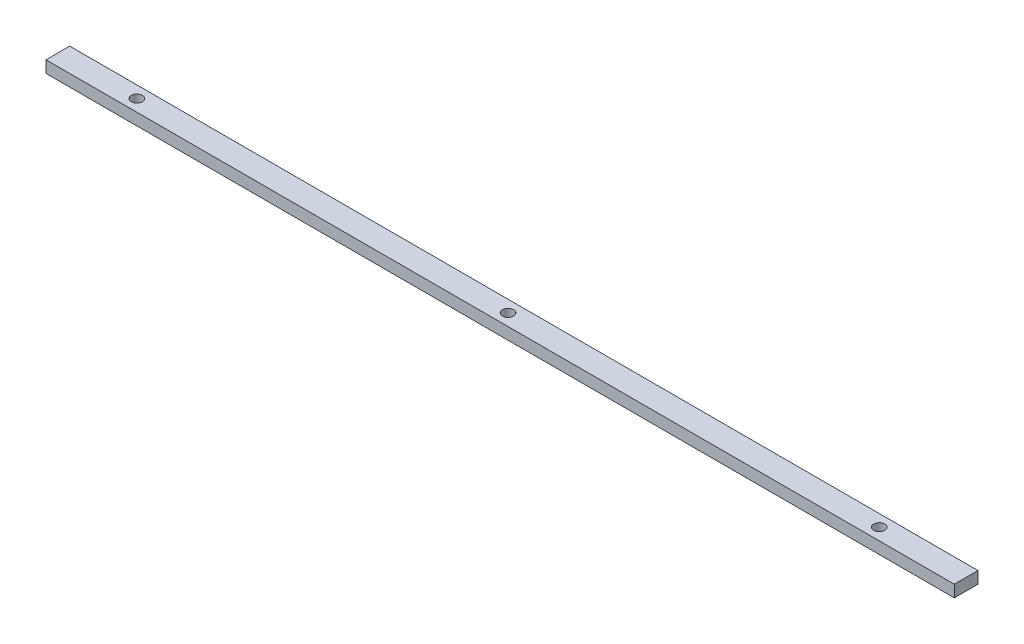
ISO-10303-21;
HEADER;
FILE_DESCRIPTION(('STEP AP214'),'2;1');
FILE_NAME('part.step','',(''),(''),'','','');
FILE_SCHEMA(('AUTOMOTIVE_DESIGN { 1 0 10303 214 1 1 1 1 }'));
ENDSEC;
DATA;
#1=APPLICATION_CONTEXT('core data for automotive mechanical design processes');
#2=APPLICATION_PROTOCOL_DEFINITION('international standard','automotive_design',2000,#1);
#3=PRODUCT_CONTEXT('',#1,'mechanical');
#4=PRODUCT('Part','Part','',(#3));
#5=PRODUCT_RELATED_PRODUCT_CATEGORY('part','',(#4));
#6=PRODUCT_DEFINITION_FORMATION('','',#4);
#7=PRODUCT_DEFINITION_CONTEXT('part definition',#1,'design');
#8=PRODUCT_DEFINITION('design','',#6,#7);
#9=PRODUCT_DEFINITION_SHAPE('','',#8);
#10=(LENGTH_UNIT() NAMED_UNIT(*) SI_UNIT(.MILLI.,.METRE.));
#11=(NAMED_UNIT(*) PLANE_ANGLE_UNIT() SI_UNIT($,.RADIAN.));
#12=(NAMED_UNIT(*) SI_UNIT($,.STERADIAN.) SOLID_ANGLE_UNIT());
#13=UNCERTAINTY_MEASURE_WITH_UNIT(LENGTH_MEASURE(1.E-05),#10,'distance_accuracy_value','');
#14=(GEOMETRIC_REPRESENTATION_CONTEXT(3) GLOBAL_UNCERTAINTY_ASSIGNED_CONTEXT((#13)) GLOBAL_UNIT_ASSIGNED_CONTEXT((#10,
#11,#12)) REPRESENTATION_CONTEXT('',''));
#15=CARTESIAN_POINT('',(0.,0.,0.));
#16=DIRECTION('',(0.,0.,1.));
#17=DIRECTION('',(1.,0.,0.));
#18=AXIS2_PLACEMENT_3D('',#15,#16,#17);
#19=CARTESIAN_POINT('',(44.0503208682354,37.6310916584124,30.));
#20=DIRECTION('',(1.,0.,0.));
#21=DIRECTION('',(0.,0.,-1.));
#22=AXIS2_PLACEMENT_3D('',#19,#20,#21);
#23=PLANE('',#22);
#24=DIRECTION('',(0.,-1.,0.));
#25=VECTOR('',#24,1.);
#26=CARTESIAN_POINT('',(44.0503208682354,37.6310916584124,0.));
#27=LINE('',#26,#25);
#28=CARTESIAN_POINT('',(44.0503208682354,37.6310916584124,0.));
#29=VERTEX_POINT('',#28);
#30=CARTESIAN_POINT('',(44.0503208682354,22.6310916584124,0.));
#31=VERTEX_POINT('',#30);
#32=EDGE_CURVE('E107',#29,#31,#27,.T.);
#33=ORIENTED_EDGE('',*,*,#32,.T.);
#34=DIRECTION('',(0.,0.,-1.));
#35=VECTOR('',#34,1.);
#36=CARTESIAN_POINT('',(44.0503208682354,22.6310916584124,30.));
#37=LINE('',#36,#35);
#38=CARTESIAN_POINT('',(44.0503208682354,22.6310916584124,30.));
#39=VERTEX_POINT('',#38);
#40=EDGE_CURVE('E11',#39,#31,#37,.T.);
#41=ORIENTED_EDGE('',*,*,#40,.F.);
#42=DIRECTION('',(0.,-1.,0.));
#43=VECTOR('',#42,1.);
#44=CARTESIAN_POINT('',(44.0503208682354,37.6310916584124,30.));
#45=LINE('',#44,#43);
#46=CARTESIAN_POINT('',(44.0503208682354,37.6310916584124,30.));
#47=VERTEX_POINT('',#46);
#48=EDGE_CURVE('E91',#47,#39,#45,.T.);
#49=ORIENTED_EDGE('',*,*,#48,.F.);
#50=DIRECTION('',(0.,0.,-1.));
#51=VECTOR('',#50,1.);
#52=CARTESIAN_POINT('',(44.0503208682354,37.6310916584124,30.));
#53=LINE('',#52,#51);
#54=EDGE_CURVE('E103',#47,#29,#53,.T.);
#55=ORIENTED_EDGE('',*,*,#54,.T.);
#56=EDGE_LOOP('',(#33,#41,#49,#55));
#57=FACE_BOUND('',#56,.T.);
#58=ADVANCED_FACE('F39',(#57),#23,.F.);
#59=CARTESIAN_POINT('',(44.0503208682354,22.6310916584124,30.));
#60=DIRECTION('',(0.,1.,0.));
#61=DIRECTION('',(0.,0.,1.));
#62=AXIS2_PLACEMENT_3D('',#59,#60,#61);
#63=PLANE('',#62);
#64=CARTESIAN_POINT('',(144.050320868235,22.6310916584124,15.));
#65=DIRECTION('',(0.,1.,0.));
#66=DIRECTION('',(0.,0.,1.));
#67=AXIS2_PLACEMENT_3D('',#64,#65,#66);
#68=CIRCLE('',#67,7.00000000000001);
#69=CARTESIAN_POINT('',(144.050320868235,22.6310916584124,22.));
#70=VERTEX_POINT('',#69);
#71=EDGE_CURVE('E111',#70,#70,#68,.T.);
#72=ORIENTED_EDGE('',*,*,#71,.T.);
#73=EDGE_LOOP('',(#72));
#74=FACE_BOUND('',#73,.T.);
#75=CARTESIAN_POINT('',(614.050320868235,22.6310916584124,15.));
#76=DIRECTION('',(0.,1.,0.));
#77=DIRECTION('',(0.,0.,1.));
#78=AXIS2_PLACEMENT_3D('',#75,#76,#77);
#79=CIRCLE('',#78,7.00000000000004);
#80=CARTESIAN_POINT('',(614.050320868235,22.6310916584124,22.));
#81=VERTEX_POINT('',#80);
#82=EDGE_CURVE('E140',#81,#81,#79,.T.);
#83=ORIENTED_EDGE('',*,*,#82,.T.);
#84=EDGE_LOOP('',(#83));
#85=FACE_BOUND('',#84,.T.);
#86=CARTESIAN_POINT('',(1084.05032086824,22.6310916584124,15.));
#87=DIRECTION('',(0.,1.,0.));
#88=DIRECTION('',(0.,0.,1.));
#89=AXIS2_PLACEMENT_3D('',#86,#87,#88);
#90=CIRCLE('',#89,7.00000000000015);
#91=CARTESIAN_POINT('',(1084.05032086824,22.6310916584124,22.0000000000001));
#92=VERTEX_POINT('',#91);
#93=EDGE_CURVE('E132',#92,#92,#90,.T.);
#94=ORIENTED_EDGE('',*,*,#93,.T.);
#95=EDGE_LOOP('',(#94));
#96=FACE_BOUND('',#95,.T.);
#97=DIRECTION('',(1.,0.,0.));
#98=VECTOR('',#97,1.);
#99=CARTESIAN_POINT('',(44.0503208682354,22.6310916584124,0.));
#100=LINE('',#99,#98);
#101=CARTESIAN_POINT('',(1194.05032086824,22.6310916584124,0.));
#102=VERTEX_POINT('',#101);
#103=EDGE_CURVE('E96',#31,#102,#100,.T.);
#104=ORIENTED_EDGE('',*,*,#103,.T.);
#105=DIRECTION('',(0.,0.,-1.));
#106=VECTOR('',#105,1.);
#107=CARTESIAN_POINT('',(1194.05032086824,22.6310916584124,30.));
#108=LINE('',#107,#106);
#109=CARTESIAN_POINT('',(1194.05032086824,22.6310916584124,30.));
#110=VERTEX_POINT('',#109);
#111=EDGE_CURVE('E48',#110,#102,#108,.T.);
#112=ORIENTED_EDGE('',*,*,#111,.F.);
#113=DIRECTION('',(1.,0.,0.));
#114=VECTOR('',#113,1.);
#115=CARTESIAN_POINT('',(44.0503208682354,22.6310916584124,30.));
#116=LINE('',#115,#114);
#117=EDGE_CURVE('E86',#39,#110,#116,.T.);
#118=ORIENTED_EDGE('',*,*,#117,.F.);
#119=ORIENTED_EDGE('',*,*,#40,.T.);
#120=EDGE_LOOP('',(#104,#112,#118,#119));
#121=FACE_BOUND('',#120,.T.);
#122=ADVANCED_FACE('F95',(#74,#85,#96,#121),#63,.F.);
#123=CARTESIAN_POINT('',(1194.05032086824,37.6310916584124,30.));
#124=DIRECTION('',(-1.,0.,0.));
#125=DIRECTION('',(0.,0.,1.));
#126=AXIS2_PLACEMENT_3D('',#123,#124,#125);
#127=PLANE('',#126);
#128=DIRECTION('',(0.,1.,0.));
#129=VECTOR('',#128,1.);
#130=CARTESIAN_POINT('',(1194.05032086824,37.6310916584124,0.));
#131=LINE('',#130,#129);
#132=CARTESIAN_POINT('',(1194.05032086824,37.6310916584124,0.));
#133=VERTEX_POINT('',#132);
#134=EDGE_CURVE('E73',#102,#133,#131,.T.);
#135=ORIENTED_EDGE('',*,*,#134,.T.);
#136=DIRECTION('',(0.,0.,-1.));
#137=VECTOR('',#136,1.);
#138=CARTESIAN_POINT('',(1194.05032086824,37.6310916584124,30.));
#139=LINE('',#138,#137);
#140=CARTESIAN_POINT('',(1194.05032086824,37.6310916584124,30.));
#141=VERTEX_POINT('',#140);
#142=EDGE_CURVE('E98',#141,#133,#139,.T.);
#143=ORIENTED_EDGE('',*,*,#142,.F.);
#144=DIRECTION('',(0.,1.,0.));
#145=VECTOR('',#144,1.);
#146=CARTESIAN_POINT('',(1194.05032086824,37.6310916584124,30.));
#147=LINE('',#146,#145);
#148=EDGE_CURVE('E89',#110,#141,#147,.T.);
#149=ORIENTED_EDGE('',*,*,#148,.F.);
#150=ORIENTED_EDGE('',*,*,#111,.T.);
#151=EDGE_LOOP('',(#135,#143,#149,#150));
#152=FACE_BOUND('',#151,.T.);
#153=ADVANCED_FACE('F99',(#152),#127,.F.);
#154=CARTESIAN_POINT('',(44.0503208682354,37.6310916584124,30.));
#155=DIRECTION('',(0.,-1.,0.));
#156=DIRECTION('',(0.,0.,-1.));
#157=AXIS2_PLACEMENT_3D('',#154,#155,#156);
#158=PLANE('',#157);
#159=CARTESIAN_POINT('',(144.050320868235,37.6310916584124,15.));
#160=DIRECTION('',(0.,1.,0.));
#161=DIRECTION('',(0.,0.,1.));
#162=AXIS2_PLACEMENT_3D('',#159,#160,#161);
#163=CIRCLE('',#162,7.00000000000001);
#164=CARTESIAN_POINT('',(144.050320868235,37.6310916584124,22.));
#165=VERTEX_POINT('',#164);
#166=EDGE_CURVE('E144',#165,#165,#163,.T.);
#167=ORIENTED_EDGE('',*,*,#166,.F.);
#168=EDGE_LOOP('',(#167));
#169=FACE_BOUND('',#168,.T.);
#170=CARTESIAN_POINT('',(614.050320868235,37.6310916584124,15.));
#171=DIRECTION('',(0.,1.,0.));
#172=DIRECTION('',(0.,0.,1.));
#173=AXIS2_PLACEMENT_3D('',#170,#171,#172);
#174=CIRCLE('',#173,7.00000000000004);
#175=CARTESIAN_POINT('',(614.050320868235,37.6310916584124,22.));
#176=VERTEX_POINT('',#175);
#177=EDGE_CURVE('E136',#176,#176,#174,.T.);
#178=ORIENTED_EDGE('',*,*,#177,.F.);
#179=EDGE_LOOP('',(#178));
#180=FACE_BOUND('',#179,.T.);
#181=CARTESIAN_POINT('',(1084.05032086824,37.6310916584124,15.));
#182=DIRECTION('',(0.,1.,0.));
#183=DIRECTION('',(0.,0.,1.));
#184=AXIS2_PLACEMENT_3D('',#181,#182,#183);
#185=CIRCLE('',#184,7.00000000000015);
#186=CARTESIAN_POINT('',(1084.05032086824,37.6310916584124,22.0000000000001));
#187=VERTEX_POINT('',#186);
#188=EDGE_CURVE('E128',#187,#187,#185,.T.);
#189=ORIENTED_EDGE('',*,*,#188,.F.);
#190=EDGE_LOOP('',(#189));
#191=FACE_BOUND('',#190,.T.);
#192=DIRECTION('',(-1.,0.,0.));
#193=VECTOR('',#192,1.);
#194=CARTESIAN_POINT('',(44.0503208682354,37.6310916584124,0.));
#195=LINE('',#194,#193);
#196=EDGE_CURVE('E79',#133,#29,#195,.T.);
#197=ORIENTED_EDGE('',*,*,#196,.T.);
#198=ORIENTED_EDGE('',*,*,#54,.F.);
#199=DIRECTION('',(-1.,0.,0.));
#200=VECTOR('',#199,1.);
#201=CARTESIAN_POINT('',(44.0503208682354,37.6310916584124,30.));
#202=LINE('',#201,#200);
#203=EDGE_CURVE('E56',#141,#47,#202,.T.);
#204=ORIENTED_EDGE('',*,*,#203,.F.);
#205=ORIENTED_EDGE('',*,*,#142,.T.);
#206=EDGE_LOOP('',(#197,#198,#204,#205));
#207=FACE_BOUND('',#206,.T.);
#208=ADVANCED_FACE('F121',(#169,#180,#191,#207),#158,.F.);
#209=CARTESIAN_POINT('',(0.,0.,30.));
#210=DIRECTION('',(0.,0.,1.));
#211=DIRECTION('',(1.,0.,0.));
#212=AXIS2_PLACEMENT_3D('',#209,#210,#211);
#213=PLANE('',#212);
#214=ORIENTED_EDGE('',*,*,#48,.T.);
#215=ORIENTED_EDGE('',*,*,#117,.T.);
#216=ORIENTED_EDGE('',*,*,#148,.T.);
#217=ORIENTED_EDGE('',*,*,#203,.T.);
#218=EDGE_LOOP('',(#214,#215,#216,#217));
#219=FACE_BOUND('',#218,.T.);
#220=ADVANCED_FACE('F87',(#219),#213,.T.);
#221=CARTESIAN_POINT('',(0.,0.,0.));
#222=DIRECTION('',(0.,0.,1.));
#223=DIRECTION('',(1.,0.,0.));
#224=AXIS2_PLACEMENT_3D('',#221,#222,#223);
#225=PLANE('',#224);
#226=ORIENTED_EDGE('',*,*,#32,.F.);
#227=ORIENTED_EDGE('',*,*,#196,.F.);
#228=ORIENTED_EDGE('',*,*,#134,.F.);
#229=ORIENTED_EDGE('',*,*,#103,.F.);
#230=EDGE_LOOP('',(#226,#227,#228,#229));
#231=FACE_BOUND('',#230,.T.);
#232=ADVANCED_FACE('F124',(#231),#225,.F.);
#233=CARTESIAN_POINT('',(1084.05032086824,22.6310916584124,15.));
#234=DIRECTION('',(0.,1.,0.));
#235=DIRECTION('',(0.,0.,1.));
#236=AXIS2_PLACEMENT_3D('',#233,#234,#235);
#237=CYLINDRICAL_SURFACE('',#236,7.00000000000015);
#238=ORIENTED_EDGE('',*,*,#93,.F.);
#239=EDGE_LOOP('',(#238));
#240=FACE_BOUND('',#239,.T.);
#241=ORIENTED_EDGE('',*,*,#188,.T.);
#242=EDGE_LOOP('',(#241));
#243=FACE_BOUND('',#242,.T.);
#244=ADVANCED_FACE('F168',(#240,#243),#237,.F.);
#245=CARTESIAN_POINT('',(614.050320868235,22.6310916584124,15.));
#246=DIRECTION('',(0.,1.,0.));
#247=DIRECTION('',(0.,0.,1.));
#248=AXIS2_PLACEMENT_3D('',#245,#246,#247);
#249=CYLINDRICAL_SURFACE('',#248,7.00000000000004);
#250=ORIENTED_EDGE('',*,*,#82,.F.);
#251=EDGE_LOOP('',(#250));
#252=FACE_BOUND('',#251,.T.);
#253=ORIENTED_EDGE('',*,*,#177,.T.);
#254=EDGE_LOOP('',(#253));
#255=FACE_BOUND('',#254,.T.);
#256=ADVANCED_FACE('F157',(#252,#255),#249,.F.);
#257=CARTESIAN_POINT('',(144.050320868235,22.6310916584124,15.));
#258=DIRECTION('',(0.,1.,0.));
#259=DIRECTION('',(0.,0.,1.));
#260=AXIS2_PLACEMENT_3D('',#257,#258,#259);
#261=CYLINDRICAL_SURFACE('',#260,7.00000000000001);
#262=ORIENTED_EDGE('',*,*,#71,.F.);
#263=EDGE_LOOP('',(#262));
#264=FACE_BOUND('',#263,.T.);
#265=ORIENTED_EDGE('',*,*,#166,.T.);
#266=EDGE_LOOP('',(#265));
#267=FACE_BOUND('',#266,.T.);
#268=ADVANCED_FACE('F154',(#264,#267),#261,.F.);
#269=CLOSED_SHELL('',(#58,#122,#153,#208,#220,#232,#244,#256,#268));
#270=MANIFOLD_SOLID_BREP('B2',#269);
#271=ADVANCED_BREP_SHAPE_REPRESENTATION('',(#18,#270),#14);
#272=SHAPE_DEFINITION_REPRESENTATION(#9,#271);
ENDSEC;
END-ISO-10303-21;
